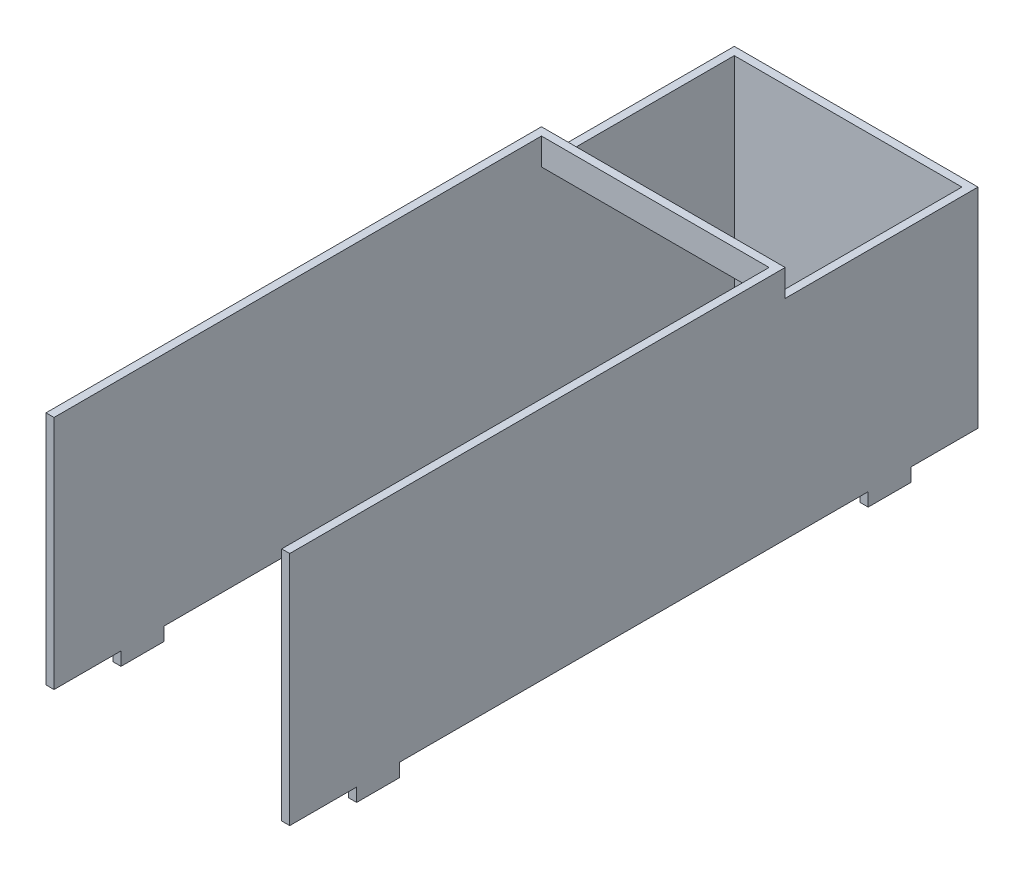
ISO-10303-21;
HEADER;
FILE_DESCRIPTION(('STEP AP214'),'2;1');
FILE_NAME('part.step','',(''),(''),'','','');
FILE_SCHEMA(('AUTOMOTIVE_DESIGN { 1 0 10303 214 1 1 1 1 }'));
ENDSEC;
DATA;
#1=APPLICATION_CONTEXT('core data for automotive mechanical design processes');
#2=APPLICATION_PROTOCOL_DEFINITION('international standard','automotive_design',2000,#1);
#3=PRODUCT_CONTEXT('',#1,'mechanical');
#4=PRODUCT('Part','Part','',(#3));
#5=PRODUCT_RELATED_PRODUCT_CATEGORY('part','',(#4));
#6=PRODUCT_DEFINITION_FORMATION('','',#4);
#7=PRODUCT_DEFINITION_CONTEXT('part definition',#1,'design');
#8=PRODUCT_DEFINITION('design','',#6,#7);
#9=PRODUCT_DEFINITION_SHAPE('','',#8);
#10=(LENGTH_UNIT() NAMED_UNIT(*) SI_UNIT(.MILLI.,.METRE.));
#11=(NAMED_UNIT(*) PLANE_ANGLE_UNIT() SI_UNIT($,.RADIAN.));
#12=(NAMED_UNIT(*) SI_UNIT($,.STERADIAN.) SOLID_ANGLE_UNIT());
#13=UNCERTAINTY_MEASURE_WITH_UNIT(LENGTH_MEASURE(1.E-05),#10,'distance_accuracy_value','');
#14=(GEOMETRIC_REPRESENTATION_CONTEXT(3) GLOBAL_UNCERTAINTY_ASSIGNED_CONTEXT((#13)) GLOBAL_UNIT_ASSIGNED_CONTEXT((#10,
#11,#12)) REPRESENTATION_CONTEXT('',''));
#15=CARTESIAN_POINT('',(0.,0.,0.));
#16=DIRECTION('',(0.,0.,1.));
#17=DIRECTION('',(1.,0.,0.));
#18=AXIS2_PLACEMENT_3D('',#15,#16,#17);
#19=CARTESIAN_POINT('',(0.,0.,0.));
#20=DIRECTION('',(0.,1.,0.));
#21=DIRECTION('',(0.,0.,1.));
#22=AXIS2_PLACEMENT_3D('',#19,#20,#21);
#23=PLANE('',#22);
#24=DIRECTION('',(-1.,0.,0.));
#25=VECTOR('',#24,1.);
#26=CARTESIAN_POINT('',(-21.25,0.,51.75));
#27=LINE('',#26,#25);
#28=CARTESIAN_POINT('',(-21.25,0.,51.75));
#29=VERTEX_POINT('',#28);
#30=CARTESIAN_POINT('',(-22.75,0.,51.75));
#31=VERTEX_POINT('',#30);
#32=EDGE_CURVE('E264',#29,#31,#27,.T.);
#33=ORIENTED_EDGE('',*,*,#32,.F.);
#34=DIRECTION('',(0.,0.,-1.));
#35=VECTOR('',#34,1.);
#36=CARTESIAN_POINT('',(-21.25,0.,-62.75));
#37=LINE('',#36,#35);
#38=CARTESIAN_POINT('',(-21.25,0.,64.25));
#39=VERTEX_POINT('',#38);
#40=EDGE_CURVE('E405',#39,#29,#37,.T.);
#41=ORIENTED_EDGE('',*,*,#40,.F.);
#42=DIRECTION('',(1.,0.,0.));
#43=VECTOR('',#42,1.);
#44=CARTESIAN_POINT('',(-22.75,0.,64.25));
#45=LINE('',#44,#43);
#46=CARTESIAN_POINT('',(-22.75,0.,64.25));
#47=VERTEX_POINT('',#46);
#48=EDGE_CURVE('E401',#47,#39,#45,.T.);
#49=ORIENTED_EDGE('',*,*,#48,.F.);
#50=DIRECTION('',(0.,0.,1.));
#51=VECTOR('',#50,1.);
#52=CARTESIAN_POINT('',(-22.75,0.,-64.25));
#53=LINE('',#52,#51);
#54=EDGE_CURVE('E397',#31,#47,#53,.T.);
#55=ORIENTED_EDGE('',*,*,#54,.F.);
#56=EDGE_LOOP('',(#33,#41,#49,#55));
#57=FACE_BOUND('',#56,.T.);
#58=ADVANCED_FACE('F33',(#57),#23,.F.);
#59=DIRECTION('',(1.,0.,0.));
#60=VECTOR('',#59,1.);
#61=CARTESIAN_POINT('',(-21.25,0.,43.75));
#62=LINE('',#61,#60);
#63=CARTESIAN_POINT('',(-22.75,0.,43.75));
#64=VERTEX_POINT('',#63);
#65=CARTESIAN_POINT('',(-21.25,0.,43.75));
#66=VERTEX_POINT('',#65);
#67=EDGE_CURVE('E269',#64,#66,#62,.T.);
#68=ORIENTED_EDGE('',*,*,#67,.F.);
#69=CARTESIAN_POINT('',(-22.75,0.,-43.75));
#70=VERTEX_POINT('',#69);
#71=EDGE_CURVE('E402',#70,#64,#53,.T.);
#72=ORIENTED_EDGE('',*,*,#71,.F.);
#73=DIRECTION('',(-1.,0.,0.));
#74=VECTOR('',#73,1.);
#75=CARTESIAN_POINT('',(-21.25,0.,-43.75));
#76=LINE('',#75,#74);
#77=CARTESIAN_POINT('',(-21.25,0.,-43.75));
#78=VERTEX_POINT('',#77);
#79=EDGE_CURVE('E310',#78,#70,#76,.T.);
#80=ORIENTED_EDGE('',*,*,#79,.F.);
#81=EDGE_CURVE('E409',#66,#78,#37,.T.);
#82=ORIENTED_EDGE('',*,*,#81,.F.);
#83=EDGE_LOOP('',(#68,#72,#80,#82));
#84=FACE_BOUND('',#83,.T.);
#85=ADVANCED_FACE('F519',(#84),#23,.F.);
#86=DIRECTION('',(1.,0.,0.));
#87=VECTOR('',#86,1.);
#88=CARTESIAN_POINT('',(21.25,0.,43.75));
#89=LINE('',#88,#87);
#90=CARTESIAN_POINT('',(21.25,0.,43.75));
#91=VERTEX_POINT('',#90);
#92=CARTESIAN_POINT('',(22.75,0.,43.75));
#93=VERTEX_POINT('',#92);
#94=EDGE_CURVE('E287',#91,#93,#89,.T.);
#95=ORIENTED_EDGE('',*,*,#94,.F.);
#96=DIRECTION('',(0.,0.,1.));
#97=VECTOR('',#96,1.);
#98=CARTESIAN_POINT('',(21.25,0.,-62.75));
#99=LINE('',#98,#97);
#100=CARTESIAN_POINT('',(21.25,0.,-43.75));
#101=VERTEX_POINT('',#100);
#102=EDGE_CURVE('E416',#101,#91,#99,.T.);
#103=ORIENTED_EDGE('',*,*,#102,.F.);
#104=DIRECTION('',(-1.,0.,0.));
#105=VECTOR('',#104,1.);
#106=CARTESIAN_POINT('',(21.25,0.,-43.75));
#107=LINE('',#106,#105);
#108=CARTESIAN_POINT('',(22.75,0.,-43.75));
#109=VERTEX_POINT('',#108);
#110=EDGE_CURVE('E339',#109,#101,#107,.T.);
#111=ORIENTED_EDGE('',*,*,#110,.F.);
#112=DIRECTION('',(0.,0.,-1.));
#113=VECTOR('',#112,1.);
#114=CARTESIAN_POINT('',(22.75,0.,-64.25));
#115=LINE('',#114,#113);
#116=EDGE_CURVE('E421',#93,#109,#115,.T.);
#117=ORIENTED_EDGE('',*,*,#116,.F.);
#118=EDGE_LOOP('',(#95,#103,#111,#117));
#119=FACE_BOUND('',#118,.T.);
#120=ADVANCED_FACE('F493',(#119),#23,.F.);
#121=DIRECTION('',(-1.,0.,0.));
#122=VECTOR('',#121,1.);
#123=CARTESIAN_POINT('',(21.25,0.,51.75));
#124=LINE('',#123,#122);
#125=CARTESIAN_POINT('',(22.75,0.,51.75));
#126=VERTEX_POINT('',#125);
#127=CARTESIAN_POINT('',(21.25,0.,51.75));
#128=VERTEX_POINT('',#127);
#129=EDGE_CURVE('E292',#126,#128,#124,.T.);
#130=ORIENTED_EDGE('',*,*,#129,.F.);
#131=CARTESIAN_POINT('',(22.75,0.,64.25));
#132=VERTEX_POINT('',#131);
#133=EDGE_CURVE('E388',#132,#126,#115,.T.);
#134=ORIENTED_EDGE('',*,*,#133,.F.);
#135=DIRECTION('',(1.,0.,0.));
#136=VECTOR('',#135,1.);
#137=CARTESIAN_POINT('',(22.75,0.,64.25));
#138=LINE('',#137,#136);
#139=CARTESIAN_POINT('',(21.25,0.,64.25));
#140=VERTEX_POINT('',#139);
#141=EDGE_CURVE('E415',#140,#132,#138,.T.);
#142=ORIENTED_EDGE('',*,*,#141,.F.);
#143=EDGE_CURVE('E411',#128,#140,#99,.T.);
#144=ORIENTED_EDGE('',*,*,#143,.F.);
#145=EDGE_LOOP('',(#130,#134,#142,#144));
#146=FACE_BOUND('',#145,.T.);
#147=ADVANCED_FACE('F504',(#146),#23,.F.);
#148=DIRECTION('',(1.,0.,0.));
#149=VECTOR('',#148,1.);
#150=CARTESIAN_POINT('',(-21.25,0.,-51.75));
#151=LINE('',#150,#149);
#152=CARTESIAN_POINT('',(-22.75,0.,-51.75));
#153=VERTEX_POINT('',#152);
#154=CARTESIAN_POINT('',(-21.25,0.,-51.75));
#155=VERTEX_POINT('',#154);
#156=EDGE_CURVE('E315',#153,#155,#151,.T.);
#157=ORIENTED_EDGE('',*,*,#156,.F.);
#158=CARTESIAN_POINT('',(-22.75,0.,-64.25));
#159=VERTEX_POINT('',#158);
#160=EDGE_CURVE('E398',#159,#153,#53,.T.);
#161=ORIENTED_EDGE('',*,*,#160,.F.);
#162=DIRECTION('',(-1.,0.,0.));
#163=VECTOR('',#162,1.);
#164=CARTESIAN_POINT('',(22.75,0.,-64.25));
#165=LINE('',#164,#163);
#166=CARTESIAN_POINT('',(22.75,0.,-64.25));
#167=VERTEX_POINT('',#166);
#168=EDGE_CURVE('E383',#167,#159,#165,.T.);
#169=ORIENTED_EDGE('',*,*,#168,.F.);
#170=CARTESIAN_POINT('',(22.75,0.,-51.75));
#171=VERTEX_POINT('',#170);
#172=EDGE_CURVE('E418',#171,#167,#115,.T.);
#173=ORIENTED_EDGE('',*,*,#172,.F.);
#174=DIRECTION('',(1.,0.,0.));
#175=VECTOR('',#174,1.);
#176=CARTESIAN_POINT('',(21.25,0.,-51.75));
#177=LINE('',#176,#175);
#178=CARTESIAN_POINT('',(21.25,0.,-51.75));
#179=VERTEX_POINT('',#178);
#180=EDGE_CURVE('E334',#179,#171,#177,.T.);
#181=ORIENTED_EDGE('',*,*,#180,.F.);
#182=CARTESIAN_POINT('',(21.25,0.,-62.75));
#183=VERTEX_POINT('',#182);
#184=EDGE_CURVE('E412',#183,#179,#99,.T.);
#185=ORIENTED_EDGE('',*,*,#184,.F.);
#186=DIRECTION('',(1.,0.,0.));
#187=VECTOR('',#186,1.);
#188=CARTESIAN_POINT('',(21.25,0.,-62.75));
#189=LINE('',#188,#187);
#190=CARTESIAN_POINT('',(-21.25,0.,-62.75));
#191=VERTEX_POINT('',#190);
#192=EDGE_CURVE('E408',#191,#183,#189,.T.);
#193=ORIENTED_EDGE('',*,*,#192,.F.);
#194=EDGE_CURVE('E404',#155,#191,#37,.T.);
#195=ORIENTED_EDGE('',*,*,#194,.F.);
#196=EDGE_LOOP('',(#157,#161,#169,#173,#181,#185,#193,#195));
#197=FACE_BOUND('',#196,.T.);
#198=ADVANCED_FACE('F470',(#197),#23,.F.);
#199=CARTESIAN_POINT('',(0.,39.,0.));
#200=DIRECTION('',(0.,1.,0.));
#201=DIRECTION('',(0.,0.,1.));
#202=AXIS2_PLACEMENT_3D('',#199,#200,#201);
#203=PLANE('',#202);
#204=DIRECTION('',(0.,0.,1.));
#205=VECTOR('',#204,1.);
#206=CARTESIAN_POINT('',(21.25,39.,-62.75));
#207=LINE('',#206,#205);
#208=CARTESIAN_POINT('',(21.25,39.,-62.75));
#209=VERTEX_POINT('',#208);
#210=CARTESIAN_POINT('',(21.25,39.,-28.25));
#211=VERTEX_POINT('',#210);
#212=EDGE_CURVE('E223',#209,#211,#207,.T.);
#213=ORIENTED_EDGE('',*,*,#212,.T.);
#214=DIRECTION('',(-1.,0.,0.));
#215=VECTOR('',#214,1.);
#216=CARTESIAN_POINT('',(21.25,39.,-28.25));
#217=LINE('',#216,#215);
#218=CARTESIAN_POINT('',(22.75,39.,-28.25));
#219=VERTEX_POINT('',#218);
#220=EDGE_CURVE('E226',#219,#211,#217,.T.);
#221=ORIENTED_EDGE('',*,*,#220,.F.);
#222=DIRECTION('',(0.,0.,-1.));
#223=VECTOR('',#222,1.);
#224=CARTESIAN_POINT('',(22.75,39.,-64.25));
#225=LINE('',#224,#223);
#226=CARTESIAN_POINT('',(22.75,39.,-64.25));
#227=VERTEX_POINT('',#226);
#228=EDGE_CURVE('E232',#219,#227,#225,.T.);
#229=ORIENTED_EDGE('',*,*,#228,.T.);
#230=DIRECTION('',(-1.,0.,0.));
#231=VECTOR('',#230,1.);
#232=CARTESIAN_POINT('',(22.75,39.,-64.25));
#233=LINE('',#232,#231);
#234=CARTESIAN_POINT('',(-22.75,39.,-64.25));
#235=VERTEX_POINT('',#234);
#236=EDGE_CURVE('E384',#227,#235,#233,.T.);
#237=ORIENTED_EDGE('',*,*,#236,.T.);
#238=DIRECTION('',(0.,0.,1.));
#239=VECTOR('',#238,1.);
#240=CARTESIAN_POINT('',(-22.75,39.,-64.25));
#241=LINE('',#240,#239);
#242=CARTESIAN_POINT('',(-22.75,39.,-28.25));
#243=VERTEX_POINT('',#242);
#244=EDGE_CURVE('E387',#235,#243,#241,.T.);
#245=ORIENTED_EDGE('',*,*,#244,.T.);
#246=DIRECTION('',(-1.,0.,0.));
#247=VECTOR('',#246,1.);
#248=CARTESIAN_POINT('',(-22.75,39.,-28.25));
#249=LINE('',#248,#247);
#250=CARTESIAN_POINT('',(-21.25,39.,-28.25));
#251=VERTEX_POINT('',#250);
#252=EDGE_CURVE('E368',#251,#243,#249,.T.);
#253=ORIENTED_EDGE('',*,*,#252,.F.);
#254=DIRECTION('',(0.,0.,-1.));
#255=VECTOR('',#254,1.);
#256=CARTESIAN_POINT('',(-21.25,39.,-62.75));
#257=LINE('',#256,#255);
#258=CARTESIAN_POINT('',(-21.25,39.,-62.75));
#259=VERTEX_POINT('',#258);
#260=EDGE_CURVE('E390',#251,#259,#257,.T.);
#261=ORIENTED_EDGE('',*,*,#260,.T.);
#262=DIRECTION('',(1.,0.,0.));
#263=VECTOR('',#262,1.);
#264=CARTESIAN_POINT('',(21.25,39.,-62.75));
#265=LINE('',#264,#263);
#266=EDGE_CURVE('E229',#259,#209,#265,.T.);
#267=ORIENTED_EDGE('',*,*,#266,.T.);
#268=EDGE_LOOP('',(#213,#221,#229,#237,#245,#253,#261,#267));
#269=FACE_BOUND('',#268,.T.);
#270=ADVANCED_FACE('F225',(#269),#203,.T.);
#271=CARTESIAN_POINT('',(22.75,39.,-64.25));
#272=DIRECTION('',(0.,0.,1.));
#273=DIRECTION('',(1.,0.,0.));
#274=AXIS2_PLACEMENT_3D('',#271,#272,#273);
#275=PLANE('',#274);
#276=ORIENTED_EDGE('',*,*,#168,.T.);
#277=DIRECTION('',(0.,-1.,0.));
#278=VECTOR('',#277,1.);
#279=CARTESIAN_POINT('',(-22.75,39.,-64.25));
#280=LINE('',#279,#278);
#281=EDGE_CURVE('E11',#235,#159,#280,.T.);
#282=ORIENTED_EDGE('',*,*,#281,.F.);
#283=ORIENTED_EDGE('',*,*,#236,.F.);
#284=DIRECTION('',(0.,-1.,0.));
#285=VECTOR('',#284,1.);
#286=CARTESIAN_POINT('',(22.75,39.,-64.25));
#287=LINE('',#286,#285);
#288=EDGE_CURVE('E394',#227,#167,#287,.T.);
#289=ORIENTED_EDGE('',*,*,#288,.T.);
#290=EDGE_LOOP('',(#276,#282,#283,#289));
#291=FACE_BOUND('',#290,.T.);
#292=ADVANCED_FACE('F35',(#291),#275,.F.);
#293=CARTESIAN_POINT('',(-22.75,39.,-64.25));
#294=DIRECTION('',(1.,0.,0.));
#295=DIRECTION('',(0.,0.,-1.));
#296=AXIS2_PLACEMENT_3D('',#293,#294,#295);
#297=PLANE('',#296);
#298=DIRECTION('',(0.,-1.,0.));
#299=VECTOR('',#298,1.);
#300=CARTESIAN_POINT('',(-22.75,44.,-28.25));
#301=LINE('',#300,#299);
#302=CARTESIAN_POINT('',(-22.75,44.,-28.25));
#303=VERTEX_POINT('',#302);
#304=EDGE_CURVE('E379',#303,#243,#301,.T.);
#305=ORIENTED_EDGE('',*,*,#304,.T.);
#306=ORIENTED_EDGE('',*,*,#244,.F.);
#307=ORIENTED_EDGE('',*,*,#281,.T.);
#308=ORIENTED_EDGE('',*,*,#160,.T.);
#309=DIRECTION('',(0.,1.,0.));
#310=VECTOR('',#309,1.);
#311=CARTESIAN_POINT('',(-22.75,-2.5,-51.75));
#312=LINE('',#311,#310);
#313=CARTESIAN_POINT('',(-22.75,-2.5,-51.75));
#314=VERTEX_POINT('',#313);
#315=EDGE_CURVE('E326',#314,#153,#312,.T.);
#316=ORIENTED_EDGE('',*,*,#315,.F.);
#317=DIRECTION('',(0.,0.,-1.));
#318=VECTOR('',#317,1.);
#319=CARTESIAN_POINT('',(-22.75,-2.5,-51.75));
#320=LINE('',#319,#318);
#321=CARTESIAN_POINT('',(-22.75,-2.5,-43.75));
#322=VERTEX_POINT('',#321);
#323=EDGE_CURVE('E317',#322,#314,#320,.T.);
#324=ORIENTED_EDGE('',*,*,#323,.F.);
#325=DIRECTION('',(0.,1.,0.));
#326=VECTOR('',#325,1.);
#327=CARTESIAN_POINT('',(-22.75,-2.5,-43.75));
#328=LINE('',#327,#326);
#329=EDGE_CURVE('E328',#322,#70,#328,.T.);
#330=ORIENTED_EDGE('',*,*,#329,.T.);
#331=ORIENTED_EDGE('',*,*,#71,.T.);
#332=DIRECTION('',(0.,1.,0.));
#333=VECTOR('',#332,1.);
#334=CARTESIAN_POINT('',(-22.75,-2.5,43.75));
#335=LINE('',#334,#333);
#336=CARTESIAN_POINT('',(-22.75,-2.5,43.75));
#337=VERTEX_POINT('',#336);
#338=EDGE_CURVE('E280',#337,#64,#335,.T.);
#339=ORIENTED_EDGE('',*,*,#338,.F.);
#340=DIRECTION('',(0.,0.,-1.));
#341=VECTOR('',#340,1.);
#342=CARTESIAN_POINT('',(-22.75,-2.5,43.75));
#343=LINE('',#342,#341);
#344=CARTESIAN_POINT('',(-22.75,-2.5,51.75));
#345=VERTEX_POINT('',#344);
#346=EDGE_CURVE('E271',#345,#337,#343,.T.);
#347=ORIENTED_EDGE('',*,*,#346,.F.);
#348=DIRECTION('',(0.,1.,0.));
#349=VECTOR('',#348,1.);
#350=CARTESIAN_POINT('',(-22.75,-2.5,51.75));
#351=LINE('',#350,#349);
#352=EDGE_CURVE('E282',#345,#31,#351,.T.);
#353=ORIENTED_EDGE('',*,*,#352,.T.);
#354=ORIENTED_EDGE('',*,*,#54,.T.);
#355=DIRECTION('',(0.,-1.,0.));
#356=VECTOR('',#355,1.);
#357=CARTESIAN_POINT('',(-22.75,39.,64.25));
#358=LINE('',#357,#356);
#359=CARTESIAN_POINT('',(-22.75,44.,64.25));
#360=VERTEX_POINT('',#359);
#361=EDGE_CURVE('E41',#360,#47,#358,.T.);
#362=ORIENTED_EDGE('',*,*,#361,.F.);
#363=DIRECTION('',(0.,0.,1.));
#364=VECTOR('',#363,1.);
#365=CARTESIAN_POINT('',(-22.75,44.,64.25));
#366=LINE('',#365,#364);
#367=EDGE_CURVE('E369',#303,#360,#366,.T.);
#368=ORIENTED_EDGE('',*,*,#367,.F.);
#369=EDGE_LOOP('',(#305,#306,#307,#308,#316,#324,#330,#331,#339,#347,#353,#354,#362,#368));
#370=FACE_BOUND('',#369,.T.);
#371=ADVANCED_FACE('F460',(#370),#297,.F.);
#372=CARTESIAN_POINT('',(-22.75,39.,64.25));
#373=DIRECTION('',(0.,0.,-1.));
#374=DIRECTION('',(-1.,0.,0.));
#375=AXIS2_PLACEMENT_3D('',#372,#373,#374);
#376=PLANE('',#375);
#377=ORIENTED_EDGE('',*,*,#48,.T.);
#378=DIRECTION('',(0.,-1.,0.));
#379=VECTOR('',#378,1.);
#380=CARTESIAN_POINT('',(-21.25,39.,64.25));
#381=LINE('',#380,#379);
#382=CARTESIAN_POINT('',(-21.25,44.,64.25));
#383=VERTEX_POINT('',#382);
#384=EDGE_CURVE('E435',#383,#39,#381,.T.);
#385=ORIENTED_EDGE('',*,*,#384,.F.);
#386=DIRECTION('',(1.,0.,0.));
#387=VECTOR('',#386,1.);
#388=CARTESIAN_POINT('',(-22.75,44.,64.25));
#389=LINE('',#388,#387);
#390=EDGE_CURVE('E371',#360,#383,#389,.T.);
#391=ORIENTED_EDGE('',*,*,#390,.F.);
#392=ORIENTED_EDGE('',*,*,#361,.T.);
#393=EDGE_LOOP('',(#377,#385,#391,#392));
#394=FACE_BOUND('',#393,.T.);
#395=ADVANCED_FACE('F442',(#394),#376,.F.);
#396=CARTESIAN_POINT('',(-21.25,39.,-62.75));
#397=DIRECTION('',(-1.,0.,0.));
#398=DIRECTION('',(0.,0.,1.));
#399=AXIS2_PLACEMENT_3D('',#396,#397,#398);
#400=PLANE('',#399);
#401=ORIENTED_EDGE('',*,*,#260,.F.);
#402=DIRECTION('',(0.,0.,1.));
#403=VECTOR('',#402,1.);
#404=CARTESIAN_POINT('',(-21.25,39.,-62.75));
#405=LINE('',#404,#403);
#406=CARTESIAN_POINT('',(-21.25,39.,-26.75));
#407=VERTEX_POINT('',#406);
#408=EDGE_CURVE('E249',#251,#407,#405,.T.);
#409=ORIENTED_EDGE('',*,*,#408,.T.);
#410=DIRECTION('',(0.,-1.,0.));
#411=VECTOR('',#410,1.);
#412=CARTESIAN_POINT('',(-21.25,39.,-26.75));
#413=LINE('',#412,#411);
#414=CARTESIAN_POINT('',(-21.25,44.,-26.75));
#415=VERTEX_POINT('',#414);
#416=EDGE_CURVE('E250',#415,#407,#413,.T.);
#417=ORIENTED_EDGE('',*,*,#416,.F.);
#418=DIRECTION('',(0.,0.,-1.));
#419=VECTOR('',#418,1.);
#420=CARTESIAN_POINT('',(-21.25,44.,64.25));
#421=LINE('',#420,#419);
#422=EDGE_CURVE('E374',#383,#415,#421,.T.);
#423=ORIENTED_EDGE('',*,*,#422,.F.);
#424=ORIENTED_EDGE('',*,*,#384,.T.);
#425=ORIENTED_EDGE('',*,*,#40,.T.);
#426=DIRECTION('',(0.,1.,0.));
#427=VECTOR('',#426,1.);
#428=CARTESIAN_POINT('',(-21.25,-2.5,51.75));
#429=LINE('',#428,#427);
#430=CARTESIAN_POINT('',(-21.25,-2.5,51.75));
#431=VERTEX_POINT('',#430);
#432=EDGE_CURVE('E285',#431,#29,#429,.T.);
#433=ORIENTED_EDGE('',*,*,#432,.F.);
#434=DIRECTION('',(0.,0.,1.));
#435=VECTOR('',#434,1.);
#436=CARTESIAN_POINT('',(-21.25,-2.5,43.75));
#437=LINE('',#436,#435);
#438=CARTESIAN_POINT('',(-21.25,-2.5,43.75));
#439=VERTEX_POINT('',#438);
#440=EDGE_CURVE('E265',#439,#431,#437,.T.);
#441=ORIENTED_EDGE('',*,*,#440,.F.);
#442=DIRECTION('',(0.,1.,0.));
#443=VECTOR('',#442,1.);
#444=CARTESIAN_POINT('',(-21.25,-2.5,43.75));
#445=LINE('',#444,#443);
#446=EDGE_CURVE('E275',#439,#66,#445,.T.);
#447=ORIENTED_EDGE('',*,*,#446,.T.);
#448=ORIENTED_EDGE('',*,*,#81,.T.);
#449=DIRECTION('',(0.,1.,0.));
#450=VECTOR('',#449,1.);
#451=CARTESIAN_POINT('',(-21.25,-2.5,-43.75));
#452=LINE('',#451,#450);
#453=CARTESIAN_POINT('',(-21.25,-2.5,-43.75));
#454=VERTEX_POINT('',#453);
#455=EDGE_CURVE('E331',#454,#78,#452,.T.);
#456=ORIENTED_EDGE('',*,*,#455,.F.);
#457=DIRECTION('',(0.,0.,1.));
#458=VECTOR('',#457,1.);
#459=CARTESIAN_POINT('',(-21.25,-2.5,-51.75));
#460=LINE('',#459,#458);
#461=CARTESIAN_POINT('',(-21.25,-2.5,-51.75));
#462=VERTEX_POINT('',#461);
#463=EDGE_CURVE('E311',#462,#454,#460,.T.);
#464=ORIENTED_EDGE('',*,*,#463,.F.);
#465=DIRECTION('',(0.,1.,0.));
#466=VECTOR('',#465,1.);
#467=CARTESIAN_POINT('',(-21.25,-2.5,-51.75));
#468=LINE('',#467,#466);
#469=EDGE_CURVE('E321',#462,#155,#468,.T.);
#470=ORIENTED_EDGE('',*,*,#469,.T.);
#471=ORIENTED_EDGE('',*,*,#194,.T.);
#472=DIRECTION('',(0.,-1.,0.));
#473=VECTOR('',#472,1.);
#474=CARTESIAN_POINT('',(-21.25,39.,-62.75));
#475=LINE('',#474,#473);
#476=EDGE_CURVE('E432',#259,#191,#475,.T.);
#477=ORIENTED_EDGE('',*,*,#476,.F.);
#478=EDGE_LOOP('',(#401,#409,#417,#423,#424,#425,#433,#441,#447,#448,#456,#464,#470,#471,#477));
#479=FACE_BOUND('',#478,.T.);
#480=ADVANCED_FACE('F452',(#479),#400,.F.);
#481=CARTESIAN_POINT('',(21.25,39.,-62.75));
#482=DIRECTION('',(0.,0.,-1.));
#483=DIRECTION('',(-1.,0.,0.));
#484=AXIS2_PLACEMENT_3D('',#481,#482,#483);
#485=PLANE('',#484);
#486=ORIENTED_EDGE('',*,*,#192,.T.);
#487=DIRECTION('',(0.,-1.,0.));
#488=VECTOR('',#487,1.);
#489=CARTESIAN_POINT('',(21.25,39.,-62.75));
#490=LINE('',#489,#488);
#491=EDGE_CURVE('E430',#209,#183,#490,.T.);
#492=ORIENTED_EDGE('',*,*,#491,.F.);
#493=ORIENTED_EDGE('',*,*,#266,.F.);
#494=ORIENTED_EDGE('',*,*,#476,.T.);
#495=EDGE_LOOP('',(#486,#492,#493,#494));
#496=FACE_BOUND('',#495,.T.);
#497=ADVANCED_FACE('F465',(#496),#485,.F.);
#498=CARTESIAN_POINT('',(21.25,39.,-62.75));
#499=DIRECTION('',(1.,0.,0.));
#500=DIRECTION('',(0.,0.,-1.));
#501=AXIS2_PLACEMENT_3D('',#498,#499,#500);
#502=PLANE('',#501);
#503=DIRECTION('',(0.,1.,0.));
#504=VECTOR('',#503,1.);
#505=CARTESIAN_POINT('',(21.25,39.,-26.75));
#506=LINE('',#505,#504);
#507=CARTESIAN_POINT('',(21.25,39.,-26.75));
#508=VERTEX_POINT('',#507);
#509=CARTESIAN_POINT('',(21.25,44.,-26.75));
#510=VERTEX_POINT('',#509);
#511=EDGE_CURVE('E48',#508,#510,#506,.T.);
#512=ORIENTED_EDGE('',*,*,#511,.F.);
#513=DIRECTION('',(0.,0.,-1.));
#514=VECTOR('',#513,1.);
#515=CARTESIAN_POINT('',(21.25,39.,-62.75));
#516=LINE('',#515,#514);
#517=EDGE_CURVE('E244',#508,#211,#516,.T.);
#518=ORIENTED_EDGE('',*,*,#517,.T.);
#519=ORIENTED_EDGE('',*,*,#212,.F.);
#520=ORIENTED_EDGE('',*,*,#491,.T.);
#521=ORIENTED_EDGE('',*,*,#184,.T.);
#522=DIRECTION('',(0.,1.,0.));
#523=VECTOR('',#522,1.);
#524=CARTESIAN_POINT('',(21.25,-2.5,-51.75));
#525=LINE('',#524,#523);
#526=CARTESIAN_POINT('',(21.25,-2.5,-51.75));
#527=VERTEX_POINT('',#526);
#528=EDGE_CURVE('E242',#527,#179,#525,.T.);
#529=ORIENTED_EDGE('',*,*,#528,.F.);
#530=DIRECTION('',(0.,0.,-1.));
#531=VECTOR('',#530,1.);
#532=CARTESIAN_POINT('',(21.25,-2.5,-51.75));
#533=LINE('',#532,#531);
#534=CARTESIAN_POINT('',(21.25,-2.5,-43.75));
#535=VERTEX_POINT('',#534);
#536=EDGE_CURVE('E335',#535,#527,#533,.T.);
#537=ORIENTED_EDGE('',*,*,#536,.F.);
#538=DIRECTION('',(0.,1.,0.));
#539=VECTOR('',#538,1.);
#540=CARTESIAN_POINT('',(21.25,-2.5,-43.75));
#541=LINE('',#540,#539);
#542=EDGE_CURVE('E345',#535,#101,#541,.T.);
#543=ORIENTED_EDGE('',*,*,#542,.T.);
#544=ORIENTED_EDGE('',*,*,#102,.T.);
#545=DIRECTION('',(0.,1.,0.));
#546=VECTOR('',#545,1.);
#547=CARTESIAN_POINT('',(21.25,-2.5,43.75));
#548=LINE('',#547,#546);
#549=CARTESIAN_POINT('',(21.25,-2.5,43.75));
#550=VERTEX_POINT('',#549);
#551=EDGE_CURVE('E308',#550,#91,#548,.T.);
#552=ORIENTED_EDGE('',*,*,#551,.F.);
#553=DIRECTION('',(0.,0.,-1.));
#554=VECTOR('',#553,1.);
#555=CARTESIAN_POINT('',(21.25,-2.5,43.75));
#556=LINE('',#555,#554);
#557=CARTESIAN_POINT('',(21.25,-2.5,51.75));
#558=VERTEX_POINT('',#557);
#559=EDGE_CURVE('E288',#558,#550,#556,.T.);
#560=ORIENTED_EDGE('',*,*,#559,.F.);
#561=DIRECTION('',(0.,1.,0.));
#562=VECTOR('',#561,1.);
#563=CARTESIAN_POINT('',(21.25,-2.5,51.75));
#564=LINE('',#563,#562);
#565=EDGE_CURVE('E298',#558,#128,#564,.T.);
#566=ORIENTED_EDGE('',*,*,#565,.T.);
#567=ORIENTED_EDGE('',*,*,#143,.T.);
#568=DIRECTION('',(0.,-1.,0.));
#569=VECTOR('',#568,1.);
#570=CARTESIAN_POINT('',(21.25,39.,64.25));
#571=LINE('',#570,#569);
#572=CARTESIAN_POINT('',(21.25,44.,64.25));
#573=VERTEX_POINT('',#572);
#574=EDGE_CURVE('E427',#573,#140,#571,.T.);
#575=ORIENTED_EDGE('',*,*,#574,.F.);
#576=DIRECTION('',(0.,0.,1.));
#577=VECTOR('',#576,1.);
#578=CARTESIAN_POINT('',(21.25,44.,64.25));
#579=LINE('',#578,#577);
#580=EDGE_CURVE('E53',#510,#573,#579,.T.);
#581=ORIENTED_EDGE('',*,*,#580,.F.);
#582=EDGE_LOOP('',(#512,#518,#519,#520,#521,#529,#537,#543,#544,#552,#560,#566,#567,#575,#581));
#583=FACE_BOUND('',#582,.T.);
#584=ADVANCED_FACE('F245',(#583),#502,.F.);
#585=CARTESIAN_POINT('',(22.75,39.,64.25));
#586=DIRECTION('',(0.,0.,-1.));
#587=DIRECTION('',(-1.,0.,0.));
#588=AXIS2_PLACEMENT_3D('',#585,#586,#587);
#589=PLANE('',#588);
#590=ORIENTED_EDGE('',*,*,#141,.T.);
#591=DIRECTION('',(0.,-1.,0.));
#592=VECTOR('',#591,1.);
#593=CARTESIAN_POINT('',(22.75,39.,64.25));
#594=LINE('',#593,#592);
#595=CARTESIAN_POINT('',(22.75,44.,64.25));
#596=VERTEX_POINT('',#595);
#597=EDGE_CURVE('E424',#596,#132,#594,.T.);
#598=ORIENTED_EDGE('',*,*,#597,.F.);
#599=DIRECTION('',(1.,0.,0.));
#600=VECTOR('',#599,1.);
#601=CARTESIAN_POINT('',(21.25,44.,64.25));
#602=LINE('',#601,#600);
#603=EDGE_CURVE('E361',#573,#596,#602,.T.);
#604=ORIENTED_EDGE('',*,*,#603,.F.);
#605=ORIENTED_EDGE('',*,*,#574,.T.);
#606=EDGE_LOOP('',(#590,#598,#604,#605));
#607=FACE_BOUND('',#606,.T.);
#608=ADVANCED_FACE('F502',(#607),#589,.F.);
#609=CARTESIAN_POINT('',(22.75,39.,-64.25));
#610=DIRECTION('',(-1.,0.,0.));
#611=DIRECTION('',(0.,0.,1.));
#612=AXIS2_PLACEMENT_3D('',#609,#610,#611);
#613=PLANE('',#612);
#614=ORIENTED_EDGE('',*,*,#228,.F.);
#615=DIRECTION('',(0.,-1.,0.));
#616=VECTOR('',#615,1.);
#617=CARTESIAN_POINT('',(22.75,44.,-28.25));
#618=LINE('',#617,#616);
#619=CARTESIAN_POINT('',(22.75,44.,-28.25));
#620=VERTEX_POINT('',#619);
#621=EDGE_CURVE('E241',#620,#219,#618,.T.);
#622=ORIENTED_EDGE('',*,*,#621,.F.);
#623=DIRECTION('',(0.,0.,-1.));
#624=VECTOR('',#623,1.);
#625=CARTESIAN_POINT('',(22.75,44.,64.25));
#626=LINE('',#625,#624);
#627=EDGE_CURVE('E364',#596,#620,#626,.T.);
#628=ORIENTED_EDGE('',*,*,#627,.F.);
#629=ORIENTED_EDGE('',*,*,#597,.T.);
#630=ORIENTED_EDGE('',*,*,#133,.T.);
#631=DIRECTION('',(0.,1.,0.));
#632=VECTOR('',#631,1.);
#633=CARTESIAN_POINT('',(22.75,-2.5,51.75));
#634=LINE('',#633,#632);
#635=CARTESIAN_POINT('',(22.75,-2.5,51.75));
#636=VERTEX_POINT('',#635);
#637=EDGE_CURVE('E304',#636,#126,#634,.T.);
#638=ORIENTED_EDGE('',*,*,#637,.F.);
#639=DIRECTION('',(0.,0.,1.));
#640=VECTOR('',#639,1.);
#641=CARTESIAN_POINT('',(22.75,-2.5,43.75));
#642=LINE('',#641,#640);
#643=CARTESIAN_POINT('',(22.75,-2.5,43.75));
#644=VERTEX_POINT('',#643);
#645=EDGE_CURVE('E294',#644,#636,#642,.T.);
#646=ORIENTED_EDGE('',*,*,#645,.F.);
#647=DIRECTION('',(0.,1.,0.));
#648=VECTOR('',#647,1.);
#649=CARTESIAN_POINT('',(22.75,-2.5,43.75));
#650=LINE('',#649,#648);
#651=EDGE_CURVE('E306',#644,#93,#650,.T.);
#652=ORIENTED_EDGE('',*,*,#651,.T.);
#653=ORIENTED_EDGE('',*,*,#116,.T.);
#654=DIRECTION('',(0.,1.,0.));
#655=VECTOR('',#654,1.);
#656=CARTESIAN_POINT('',(22.75,-2.5,-43.75));
#657=LINE('',#656,#655);
#658=CARTESIAN_POINT('',(22.75,-2.5,-43.75));
#659=VERTEX_POINT('',#658);
#660=EDGE_CURVE('E352',#659,#109,#657,.T.);
#661=ORIENTED_EDGE('',*,*,#660,.F.);
#662=DIRECTION('',(0.,0.,1.));
#663=VECTOR('',#662,1.);
#664=CARTESIAN_POINT('',(22.75,-2.5,-51.75));
#665=LINE('',#664,#663);
#666=CARTESIAN_POINT('',(22.75,-2.5,-51.75));
#667=VERTEX_POINT('',#666);
#668=EDGE_CURVE('E341',#667,#659,#665,.T.);
#669=ORIENTED_EDGE('',*,*,#668,.F.);
#670=DIRECTION('',(0.,1.,0.));
#671=VECTOR('',#670,1.);
#672=CARTESIAN_POINT('',(22.75,-2.5,-51.75));
#673=LINE('',#672,#671);
#674=EDGE_CURVE('E355',#667,#171,#673,.T.);
#675=ORIENTED_EDGE('',*,*,#674,.T.);
#676=ORIENTED_EDGE('',*,*,#172,.T.);
#677=ORIENTED_EDGE('',*,*,#288,.F.);
#678=EDGE_LOOP('',(#614,#622,#628,#629,#630,#638,#646,#652,#653,#661,#669,#675,#676,#677));
#679=FACE_BOUND('',#678,.T.);
#680=ADVANCED_FACE('F477',(#679),#613,.F.);
#681=CARTESIAN_POINT('',(-22.75,44.,-28.25));
#682=DIRECTION('',(0.,0.,1.));
#683=DIRECTION('',(1.,0.,0.));
#684=AXIS2_PLACEMENT_3D('',#681,#682,#683);
#685=PLANE('',#684);
#686=ORIENTED_EDGE('',*,*,#252,.T.);
#687=ORIENTED_EDGE('',*,*,#304,.F.);
#688=DIRECTION('',(-1.,0.,0.));
#689=VECTOR('',#688,1.);
#690=CARTESIAN_POINT('',(-22.75,44.,-28.25));
#691=LINE('',#690,#689);
#692=EDGE_CURVE('E377',#620,#303,#691,.T.);
#693=ORIENTED_EDGE('',*,*,#692,.F.);
#694=ORIENTED_EDGE('',*,*,#621,.T.);
#695=ORIENTED_EDGE('',*,*,#220,.T.);
#696=DIRECTION('',(-1.,0.,0.));
#697=VECTOR('',#696,1.);
#698=CARTESIAN_POINT('',(22.75,39.,-28.25));
#699=LINE('',#698,#697);
#700=EDGE_CURVE('E238',#211,#251,#699,.T.);
#701=ORIENTED_EDGE('',*,*,#700,.T.);
#702=EDGE_LOOP('',(#686,#687,#693,#694,#695,#701));
#703=FACE_BOUND('',#702,.T.);
#704=ADVANCED_FACE('F236',(#703),#685,.F.);
#705=CARTESIAN_POINT('',(0.,44.,0.));
#706=DIRECTION('',(0.,-1.,0.));
#707=DIRECTION('',(0.,0.,-1.));
#708=AXIS2_PLACEMENT_3D('',#705,#706,#707);
#709=PLANE('',#708);
#710=ORIENTED_EDGE('',*,*,#367,.T.);
#711=ORIENTED_EDGE('',*,*,#390,.T.);
#712=ORIENTED_EDGE('',*,*,#422,.T.);
#713=DIRECTION('',(1.,0.,0.));
#714=VECTOR('',#713,1.);
#715=CARTESIAN_POINT('',(22.75,44.,-26.75));
#716=LINE('',#715,#714);
#717=EDGE_CURVE('E257',#415,#510,#716,.T.);
#718=ORIENTED_EDGE('',*,*,#717,.T.);
#719=ORIENTED_EDGE('',*,*,#580,.T.);
#720=ORIENTED_EDGE('',*,*,#603,.T.);
#721=ORIENTED_EDGE('',*,*,#627,.T.);
#722=ORIENTED_EDGE('',*,*,#692,.T.);
#723=EDGE_LOOP('',(#710,#711,#712,#718,#719,#720,#721,#722));
#724=FACE_BOUND('',#723,.T.);
#725=ADVANCED_FACE('F457',(#724),#709,.F.);
#726=CARTESIAN_POINT('',(21.25,-2.5,-51.75));
#727=DIRECTION('',(0.,0.,1.));
#728=DIRECTION('',(1.,0.,0.));
#729=AXIS2_PLACEMENT_3D('',#726,#727,#728);
#730=PLANE('',#729);
#731=ORIENTED_EDGE('',*,*,#180,.T.);
#732=ORIENTED_EDGE('',*,*,#674,.F.);
#733=DIRECTION('',(1.,0.,0.));
#734=VECTOR('',#733,1.);
#735=CARTESIAN_POINT('',(21.25,-2.5,-51.75));
#736=LINE('',#735,#734);
#737=EDGE_CURVE('E338',#527,#667,#736,.T.);
#738=ORIENTED_EDGE('',*,*,#737,.F.);
#739=ORIENTED_EDGE('',*,*,#528,.T.);
#740=EDGE_LOOP('',(#731,#732,#738,#739));
#741=FACE_BOUND('',#740,.T.);
#742=ADVANCED_FACE('F474',(#741),#730,.F.);
#743=CARTESIAN_POINT('',(21.25,-2.5,-43.75));
#744=DIRECTION('',(0.,0.,-1.));
#745=DIRECTION('',(-1.,0.,0.));
#746=AXIS2_PLACEMENT_3D('',#743,#744,#745);
#747=PLANE('',#746);
#748=ORIENTED_EDGE('',*,*,#110,.T.);
#749=ORIENTED_EDGE('',*,*,#542,.F.);
#750=DIRECTION('',(-1.,0.,0.));
#751=VECTOR('',#750,1.);
#752=CARTESIAN_POINT('',(21.25,-2.5,-43.75));
#753=LINE('',#752,#751);
#754=EDGE_CURVE('E343',#659,#535,#753,.T.);
#755=ORIENTED_EDGE('',*,*,#754,.F.);
#756=ORIENTED_EDGE('',*,*,#660,.T.);
#757=EDGE_LOOP('',(#748,#749,#755,#756));
#758=FACE_BOUND('',#757,.T.);
#759=ADVANCED_FACE('F488',(#758),#747,.F.);
#760=CARTESIAN_POINT('',(0.,-2.5,0.));
#761=DIRECTION('',(0.,1.,0.));
#762=DIRECTION('',(0.,0.,1.));
#763=AXIS2_PLACEMENT_3D('',#760,#761,#762);
#764=PLANE('',#763);
#765=ORIENTED_EDGE('',*,*,#536,.T.);
#766=ORIENTED_EDGE('',*,*,#737,.T.);
#767=ORIENTED_EDGE('',*,*,#668,.T.);
#768=ORIENTED_EDGE('',*,*,#754,.T.);
#769=EDGE_LOOP('',(#765,#766,#767,#768));
#770=FACE_BOUND('',#769,.T.);
#771=ADVANCED_FACE('F482',(#770),#764,.F.);
#772=CARTESIAN_POINT('',(-21.25,-2.5,-43.75));
#773=DIRECTION('',(0.,0.,-1.));
#774=DIRECTION('',(-1.,0.,0.));
#775=AXIS2_PLACEMENT_3D('',#772,#773,#774);
#776=PLANE('',#775);
#777=ORIENTED_EDGE('',*,*,#79,.T.);
#778=ORIENTED_EDGE('',*,*,#329,.F.);
#779=DIRECTION('',(-1.,0.,0.));
#780=VECTOR('',#779,1.);
#781=CARTESIAN_POINT('',(-21.25,-2.5,-43.75));
#782=LINE('',#781,#780);
#783=EDGE_CURVE('E314',#454,#322,#782,.T.);
#784=ORIENTED_EDGE('',*,*,#783,.F.);
#785=ORIENTED_EDGE('',*,*,#455,.T.);
#786=EDGE_LOOP('',(#777,#778,#784,#785));
#787=FACE_BOUND('',#786,.T.);
#788=ADVANCED_FACE('F554',(#787),#776,.F.);
#789=CARTESIAN_POINT('',(-21.25,-2.5,-51.75));
#790=DIRECTION('',(0.,0.,1.));
#791=DIRECTION('',(1.,0.,0.));
#792=AXIS2_PLACEMENT_3D('',#789,#790,#791);
#793=PLANE('',#792);
#794=ORIENTED_EDGE('',*,*,#156,.T.);
#795=ORIENTED_EDGE('',*,*,#469,.F.);
#796=DIRECTION('',(1.,0.,0.));
#797=VECTOR('',#796,1.);
#798=CARTESIAN_POINT('',(-21.25,-2.5,-51.75));
#799=LINE('',#798,#797);
#800=EDGE_CURVE('E319',#314,#462,#799,.T.);
#801=ORIENTED_EDGE('',*,*,#800,.F.);
#802=ORIENTED_EDGE('',*,*,#315,.T.);
#803=EDGE_LOOP('',(#794,#795,#801,#802));
#804=FACE_BOUND('',#803,.T.);
#805=ADVANCED_FACE('F557',(#804),#793,.F.);
#806=CARTESIAN_POINT('',(0.,-2.5,0.));
#807=DIRECTION('',(0.,-1.,0.));
#808=DIRECTION('',(0.,0.,-1.));
#809=AXIS2_PLACEMENT_3D('',#806,#807,#808);
#810=PLANE('',#809);
#811=ORIENTED_EDGE('',*,*,#463,.T.);
#812=ORIENTED_EDGE('',*,*,#783,.T.);
#813=ORIENTED_EDGE('',*,*,#323,.T.);
#814=ORIENTED_EDGE('',*,*,#800,.T.);
#815=EDGE_LOOP('',(#811,#812,#813,#814));
#816=FACE_BOUND('',#815,.T.);
#817=ADVANCED_FACE('F561',(#816),#810,.T.);
#818=CARTESIAN_POINT('',(21.25,-2.5,43.75));
#819=DIRECTION('',(0.,0.,1.));
#820=DIRECTION('',(1.,0.,0.));
#821=AXIS2_PLACEMENT_3D('',#818,#819,#820);
#822=PLANE('',#821);
#823=ORIENTED_EDGE('',*,*,#94,.T.);
#824=ORIENTED_EDGE('',*,*,#651,.F.);
#825=DIRECTION('',(1.,0.,0.));
#826=VECTOR('',#825,1.);
#827=CARTESIAN_POINT('',(21.25,-2.5,43.75));
#828=LINE('',#827,#826);
#829=EDGE_CURVE('E291',#550,#644,#828,.T.);
#830=ORIENTED_EDGE('',*,*,#829,.F.);
#831=ORIENTED_EDGE('',*,*,#551,.T.);
#832=EDGE_LOOP('',(#823,#824,#830,#831));
#833=FACE_BOUND('',#832,.T.);
#834=ADVANCED_FACE('F565',(#833),#822,.F.);
#835=CARTESIAN_POINT('',(21.25,-2.5,51.75));
#836=DIRECTION('',(0.,0.,-1.));
#837=DIRECTION('',(-1.,0.,0.));
#838=AXIS2_PLACEMENT_3D('',#835,#836,#837);
#839=PLANE('',#838);
#840=ORIENTED_EDGE('',*,*,#129,.T.);
#841=ORIENTED_EDGE('',*,*,#565,.F.);
#842=DIRECTION('',(-1.,0.,0.));
#843=VECTOR('',#842,1.);
#844=CARTESIAN_POINT('',(21.25,-2.5,51.75));
#845=LINE('',#844,#843);
#846=EDGE_CURVE('E296',#636,#558,#845,.T.);
#847=ORIENTED_EDGE('',*,*,#846,.F.);
#848=ORIENTED_EDGE('',*,*,#637,.T.);
#849=EDGE_LOOP('',(#840,#841,#847,#848));
#850=FACE_BOUND('',#849,.T.);
#851=ADVANCED_FACE('F569',(#850),#839,.F.);
#852=CARTESIAN_POINT('',(0.,-2.5,0.));
#853=DIRECTION('',(0.,1.,0.));
#854=DIRECTION('',(0.,0.,1.));
#855=AXIS2_PLACEMENT_3D('',#852,#853,#854);
#856=PLANE('',#855);
#857=ORIENTED_EDGE('',*,*,#559,.T.);
#858=ORIENTED_EDGE('',*,*,#829,.T.);
#859=ORIENTED_EDGE('',*,*,#645,.T.);
#860=ORIENTED_EDGE('',*,*,#846,.T.);
#861=EDGE_LOOP('',(#857,#858,#859,#860));
#862=FACE_BOUND('',#861,.T.);
#863=ADVANCED_FACE('F573',(#862),#856,.F.);
#864=CARTESIAN_POINT('',(-21.25,-2.5,51.75));
#865=DIRECTION('',(0.,0.,-1.));
#866=DIRECTION('',(-1.,0.,0.));
#867=AXIS2_PLACEMENT_3D('',#864,#865,#866);
#868=PLANE('',#867);
#869=ORIENTED_EDGE('',*,*,#32,.T.);
#870=ORIENTED_EDGE('',*,*,#352,.F.);
#871=DIRECTION('',(-1.,0.,0.));
#872=VECTOR('',#871,1.);
#873=CARTESIAN_POINT('',(-21.25,-2.5,51.75));
#874=LINE('',#873,#872);
#875=EDGE_CURVE('E268',#431,#345,#874,.T.);
#876=ORIENTED_EDGE('',*,*,#875,.F.);
#877=ORIENTED_EDGE('',*,*,#432,.T.);
#878=EDGE_LOOP('',(#869,#870,#876,#877));
#879=FACE_BOUND('',#878,.T.);
#880=ADVANCED_FACE('F577',(#879),#868,.F.);
#881=CARTESIAN_POINT('',(-21.25,-2.5,43.75));
#882=DIRECTION('',(0.,0.,1.));
#883=DIRECTION('',(1.,0.,0.));
#884=AXIS2_PLACEMENT_3D('',#881,#882,#883);
#885=PLANE('',#884);
#886=ORIENTED_EDGE('',*,*,#67,.T.);
#887=ORIENTED_EDGE('',*,*,#446,.F.);
#888=DIRECTION('',(1.,0.,0.));
#889=VECTOR('',#888,1.);
#890=CARTESIAN_POINT('',(-21.25,-2.5,43.75));
#891=LINE('',#890,#889);
#892=EDGE_CURVE('E273',#337,#439,#891,.T.);
#893=ORIENTED_EDGE('',*,*,#892,.F.);
#894=ORIENTED_EDGE('',*,*,#338,.T.);
#895=EDGE_LOOP('',(#886,#887,#893,#894));
#896=FACE_BOUND('',#895,.T.);
#897=ADVANCED_FACE('F581',(#896),#885,.F.);
#898=CARTESIAN_POINT('',(0.,-2.5,0.));
#899=DIRECTION('',(0.,-1.,0.));
#900=DIRECTION('',(0.,0.,-1.));
#901=AXIS2_PLACEMENT_3D('',#898,#899,#900);
#902=PLANE('',#901);
#903=ORIENTED_EDGE('',*,*,#440,.T.);
#904=ORIENTED_EDGE('',*,*,#875,.T.);
#905=ORIENTED_EDGE('',*,*,#346,.T.);
#906=ORIENTED_EDGE('',*,*,#892,.T.);
#907=EDGE_LOOP('',(#903,#904,#905,#906));
#908=FACE_BOUND('',#907,.T.);
#909=ADVANCED_FACE('F516',(#908),#902,.T.);
#910=CARTESIAN_POINT('',(22.75,39.,-26.75));
#911=DIRECTION('',(0.,-1.,0.));
#912=DIRECTION('',(0.,0.,-1.));
#913=AXIS2_PLACEMENT_3D('',#910,#911,#912);
#914=PLANE('',#913);
#915=ORIENTED_EDGE('',*,*,#408,.F.);
#916=ORIENTED_EDGE('',*,*,#700,.F.);
#917=ORIENTED_EDGE('',*,*,#517,.F.);
#918=DIRECTION('',(-1.,0.,0.));
#919=VECTOR('',#918,1.);
#920=CARTESIAN_POINT('',(22.75,39.,-26.75));
#921=LINE('',#920,#919);
#922=EDGE_CURVE('E255',#508,#407,#921,.T.);
#923=ORIENTED_EDGE('',*,*,#922,.T.);
#924=EDGE_LOOP('',(#915,#916,#917,#923));
#925=FACE_BOUND('',#924,.T.);
#926=ADVANCED_FACE('F252',(#925),#914,.T.);
#927=CARTESIAN_POINT('',(0.,0.,-26.75));
#928=DIRECTION('',(0.,0.,-1.));
#929=DIRECTION('',(-1.,0.,0.));
#930=AXIS2_PLACEMENT_3D('',#927,#928,#929);
#931=PLANE('',#930);
#932=ORIENTED_EDGE('',*,*,#717,.F.);
#933=ORIENTED_EDGE('',*,*,#416,.T.);
#934=ORIENTED_EDGE('',*,*,#922,.F.);
#935=ORIENTED_EDGE('',*,*,#511,.T.);
#936=EDGE_LOOP('',(#932,#933,#934,#935));
#937=FACE_BOUND('',#936,.T.);
#938=ADVANCED_FACE('F510',(#937),#931,.F.);
#939=CLOSED_SHELL('',(#58,#85,#120,#147,#198,#270,#292,#371,#395,#480,#497,#584,#608,#680,#704,
#725,#742,#759,#771,#788,#805,#817,#834,#851,#863,#880,#897,#909,#926,#938));
#940=MANIFOLD_SOLID_BREP('B2',#939);
#941=ADVANCED_BREP_SHAPE_REPRESENTATION('',(#18,#940),#14);
#942=SHAPE_DEFINITION_REPRESENTATION(#9,#941);
ENDSEC;
END-ISO-10303-21;
